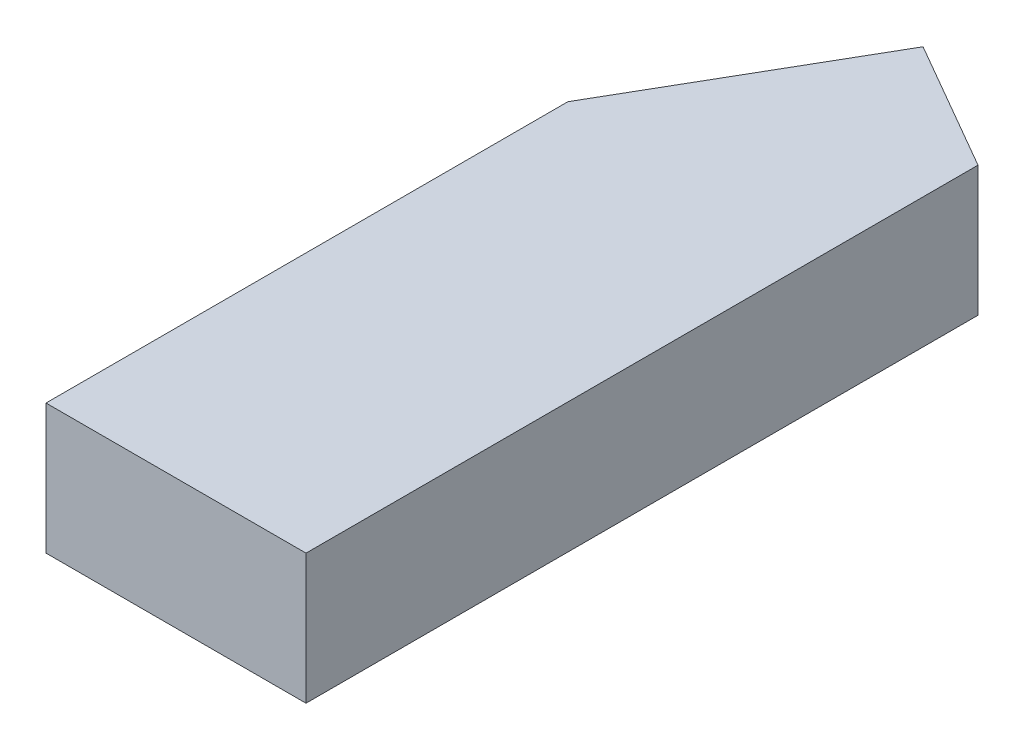
ISO-10303-21;
HEADER;
FILE_DESCRIPTION(('STEP AP214'),'2;1');
FILE_NAME('part.step','',(''),(''),'','','');
FILE_SCHEMA(('AUTOMOTIVE_DESIGN { 1 0 10303 214 1 1 1 1 }'));
ENDSEC;
DATA;
#1=APPLICATION_CONTEXT('core data for automotive mechanical design processes');
#2=APPLICATION_PROTOCOL_DEFINITION('international standard','automotive_design',2000,#1);
#3=PRODUCT_CONTEXT('',#1,'mechanical');
#4=PRODUCT('Part','Part','',(#3));
#5=PRODUCT_RELATED_PRODUCT_CATEGORY('part','',(#4));
#6=PRODUCT_DEFINITION_FORMATION('','',#4);
#7=PRODUCT_DEFINITION_CONTEXT('part definition',#1,'design');
#8=PRODUCT_DEFINITION('design','',#6,#7);
#9=PRODUCT_DEFINITION_SHAPE('','',#8);
#10=(LENGTH_UNIT() NAMED_UNIT(*) SI_UNIT(.MILLI.,.METRE.));
#11=(NAMED_UNIT(*) PLANE_ANGLE_UNIT() SI_UNIT($,.RADIAN.));
#12=(NAMED_UNIT(*) SI_UNIT($,.STERADIAN.) SOLID_ANGLE_UNIT());
#13=UNCERTAINTY_MEASURE_WITH_UNIT(LENGTH_MEASURE(1.E-05),#10,'distance_accuracy_value','');
#14=(GEOMETRIC_REPRESENTATION_CONTEXT(3) GLOBAL_UNCERTAINTY_ASSIGNED_CONTEXT((#13)) GLOBAL_UNIT_ASSIGNED_CONTEXT((#10,
#11,#12)) REPRESENTATION_CONTEXT('',''));
#15=CARTESIAN_POINT('',(0.,0.,0.));
#16=DIRECTION('',(0.,0.,1.));
#17=DIRECTION('',(1.,0.,0.));
#18=AXIS2_PLACEMENT_3D('',#15,#16,#17);
#19=CARTESIAN_POINT('',(59.9615242270666,10.,17.0717967697246));
#20=DIRECTION('',(-1.,0.,0.));
#21=DIRECTION('',(0.,0.,1.));
#22=AXIS2_PLACEMENT_3D('',#19,#20,#21);
#23=PLANE('',#22);
#24=DIRECTION('',(0.,0.,-1.));
#25=VECTOR('',#24,1.);
#26=CARTESIAN_POINT('',(59.9615242270666,0.,17.0717967697246));
#27=LINE('',#26,#25);
#28=CARTESIAN_POINT('',(59.9615242270666,0.,17.0717967697246));
#29=VERTEX_POINT('',#28);
#30=CARTESIAN_POINT('',(59.9615242270658,0.,-34.6188021535207));
#31=VERTEX_POINT('',#30);
#32=EDGE_CURVE('E154',#29,#31,#27,.T.);
#33=ORIENTED_EDGE('',*,*,#32,.T.);
#34=DIRECTION('',(0.,-1.,0.));
#35=VECTOR('',#34,1.);
#36=CARTESIAN_POINT('',(59.9615242270658,10.,-34.6188021535207));
#37=LINE('',#36,#35);
#38=CARTESIAN_POINT('',(59.9615242270658,10.,-34.6188021535207));
#39=VERTEX_POINT('',#38);
#40=EDGE_CURVE('E12',#39,#31,#37,.T.);
#41=ORIENTED_EDGE('',*,*,#40,.F.);
#42=DIRECTION('',(0.,0.,-1.));
#43=VECTOR('',#42,1.);
#44=CARTESIAN_POINT('',(59.9615242270666,10.,17.0717967697246));
#45=LINE('',#44,#43);
#46=CARTESIAN_POINT('',(59.9615242270666,10.,17.0717967697246));
#47=VERTEX_POINT('',#46);
#48=EDGE_CURVE('E133',#47,#39,#45,.T.);
#49=ORIENTED_EDGE('',*,*,#48,.F.);
#50=DIRECTION('',(0.,-1.,0.));
#51=VECTOR('',#50,1.);
#52=CARTESIAN_POINT('',(59.9615242270666,10.,17.0717967697246));
#53=LINE('',#52,#51);
#54=EDGE_CURVE('E121',#47,#29,#53,.T.);
#55=ORIENTED_EDGE('',*,*,#54,.T.);
#56=EDGE_LOOP('',(#33,#41,#49,#55));
#57=FACE_BOUND('',#56,.T.);
#58=ADVANCED_FACE('F46',(#57),#23,.F.);
#59=CARTESIAN_POINT('',(59.9615242270658,10.,-34.6188021535207));
#60=DIRECTION('',(-0.499999999999999,0.,0.866025403784439));
#61=DIRECTION('',(0.866025403784439,0.,0.499999999999999));
#62=AXIS2_PLACEMENT_3D('',#59,#60,#61);
#63=PLANE('',#62);
#64=DIRECTION('',(-0.866025403784439,0.,-0.499999999999999));
#65=VECTOR('',#64,1.);
#66=CARTESIAN_POINT('',(59.9615242270658,0.,-34.6188021535207));
#67=LINE('',#66,#65);
#68=CARTESIAN_POINT('',(49.9615242270658,0.,-40.392304845417));
#69=VERTEX_POINT('',#68);
#70=EDGE_CURVE('E151',#31,#69,#67,.T.);
#71=ORIENTED_EDGE('',*,*,#70,.T.);
#72=DIRECTION('',(0.,-1.,0.));
#73=VECTOR('',#72,1.);
#74=CARTESIAN_POINT('',(49.9615242270658,10.,-40.392304845417));
#75=LINE('',#74,#73);
#76=CARTESIAN_POINT('',(49.9615242270658,10.,-40.392304845417));
#77=VERTEX_POINT('',#76);
#78=EDGE_CURVE('E55',#77,#69,#75,.T.);
#79=ORIENTED_EDGE('',*,*,#78,.F.);
#80=DIRECTION('',(-0.866025403784439,0.,-0.499999999999999));
#81=VECTOR('',#80,1.);
#82=CARTESIAN_POINT('',(59.9615242270658,10.,-34.6188021535207));
#83=LINE('',#82,#81);
#84=EDGE_CURVE('E97',#39,#77,#83,.T.);
#85=ORIENTED_EDGE('',*,*,#84,.F.);
#86=ORIENTED_EDGE('',*,*,#40,.T.);
#87=EDGE_LOOP('',(#71,#79,#85,#86));
#88=FACE_BOUND('',#87,.T.);
#89=ADVANCED_FACE('F170',(#88),#63,.F.);
#90=CARTESIAN_POINT('',(39.9615242270658,10.,-23.0717967697282));
#91=DIRECTION('',(0.866025403784439,0.,0.499999999999999));
#92=DIRECTION('',(0.499999999999999,0.,-0.866025403784439));
#93=AXIS2_PLACEMENT_3D('',#90,#91,#92);
#94=PLANE('',#93);
#95=DIRECTION('',(-0.499999999999999,0.,0.866025403784439));
#96=VECTOR('',#95,1.);
#97=CARTESIAN_POINT('',(39.9615242270658,0.,-23.0717967697282));
#98=LINE('',#97,#96);
#99=CARTESIAN_POINT('',(39.9615242270658,0.,-23.0717967697282));
#100=VERTEX_POINT('',#99);
#101=EDGE_CURVE('E113',#69,#100,#98,.T.);
#102=ORIENTED_EDGE('',*,*,#101,.T.);
#103=DIRECTION('',(0.,-1.,0.));
#104=VECTOR('',#103,1.);
#105=CARTESIAN_POINT('',(39.9615242270658,10.,-23.0717967697282));
#106=LINE('',#105,#104);
#107=CARTESIAN_POINT('',(39.9615242270658,10.,-23.0717967697282));
#108=VERTEX_POINT('',#107);
#109=EDGE_CURVE('E110',#108,#100,#106,.T.);
#110=ORIENTED_EDGE('',*,*,#109,.F.);
#111=DIRECTION('',(-0.499999999999999,0.,0.866025403784439));
#112=VECTOR('',#111,1.);
#113=CARTESIAN_POINT('',(39.9615242270658,10.,-23.0717967697282));
#114=LINE('',#113,#112);
#115=EDGE_CURVE('E101',#77,#108,#114,.T.);
#116=ORIENTED_EDGE('',*,*,#115,.F.);
#117=ORIENTED_EDGE('',*,*,#78,.T.);
#118=EDGE_LOOP('',(#102,#110,#116,#117));
#119=FACE_BOUND('',#118,.T.);
#120=ADVANCED_FACE('F111',(#119),#94,.F.);
#121=CARTESIAN_POINT('',(39.9615242270666,10.,17.0717967697246));
#122=DIRECTION('',(1.,0.,0.));
#123=DIRECTION('',(0.,0.,-1.));
#124=AXIS2_PLACEMENT_3D('',#121,#122,#123);
#125=PLANE('',#124);
#126=DIRECTION('',(0.,0.,1.));
#127=VECTOR('',#126,1.);
#128=CARTESIAN_POINT('',(39.9615242270666,0.,17.0717967697246));
#129=LINE('',#128,#127);
#130=CARTESIAN_POINT('',(39.9615242270666,0.,17.0717967697246));
#131=VERTEX_POINT('',#130);
#132=EDGE_CURVE('E83',#100,#131,#129,.T.);
#133=ORIENTED_EDGE('',*,*,#132,.T.);
#134=DIRECTION('',(0.,-1.,0.));
#135=VECTOR('',#134,1.);
#136=CARTESIAN_POINT('',(39.9615242270666,10.,17.0717967697246));
#137=LINE('',#136,#135);
#138=CARTESIAN_POINT('',(39.9615242270666,10.,17.0717967697246));
#139=VERTEX_POINT('',#138);
#140=EDGE_CURVE('E115',#139,#131,#137,.T.);
#141=ORIENTED_EDGE('',*,*,#140,.F.);
#142=DIRECTION('',(0.,0.,1.));
#143=VECTOR('',#142,1.);
#144=CARTESIAN_POINT('',(39.9615242270666,10.,17.0717967697246));
#145=LINE('',#144,#143);
#146=EDGE_CURVE('E105',#108,#139,#145,.T.);
#147=ORIENTED_EDGE('',*,*,#146,.F.);
#148=ORIENTED_EDGE('',*,*,#109,.T.);
#149=EDGE_LOOP('',(#133,#141,#147,#148));
#150=FACE_BOUND('',#149,.T.);
#151=ADVANCED_FACE('F117',(#150),#125,.F.);
#152=CARTESIAN_POINT('',(59.9615242270666,10.,17.0717967697246));
#153=DIRECTION('',(0.,0.,-1.));
#154=DIRECTION('',(-1.,0.,0.));
#155=AXIS2_PLACEMENT_3D('',#152,#153,#154);
#156=PLANE('',#155);
#157=DIRECTION('',(1.,0.,0.));
#158=VECTOR('',#157,1.);
#159=CARTESIAN_POINT('',(59.9615242270666,0.,17.0717967697246));
#160=LINE('',#159,#158);
#161=EDGE_CURVE('E89',#131,#29,#160,.T.);
#162=ORIENTED_EDGE('',*,*,#161,.T.);
#163=ORIENTED_EDGE('',*,*,#54,.F.);
#164=DIRECTION('',(1.,0.,0.));
#165=VECTOR('',#164,1.);
#166=CARTESIAN_POINT('',(59.9615242270666,10.,17.0717967697246));
#167=LINE('',#166,#165);
#168=EDGE_CURVE('E63',#139,#47,#167,.T.);
#169=ORIENTED_EDGE('',*,*,#168,.F.);
#170=ORIENTED_EDGE('',*,*,#140,.T.);
#171=EDGE_LOOP('',(#162,#163,#169,#170));
#172=FACE_BOUND('',#171,.T.);
#173=ADVANCED_FACE('F159',(#172),#156,.F.);
#174=CARTESIAN_POINT('',(0.,10.,0.));
#175=DIRECTION('',(0.,1.,0.));
#176=DIRECTION('',(0.,0.,1.));
#177=AXIS2_PLACEMENT_3D('',#174,#175,#176);
#178=PLANE('',#177);
#179=ORIENTED_EDGE('',*,*,#48,.T.);
#180=ORIENTED_EDGE('',*,*,#84,.T.);
#181=ORIENTED_EDGE('',*,*,#115,.T.);
#182=ORIENTED_EDGE('',*,*,#146,.T.);
#183=ORIENTED_EDGE('',*,*,#168,.T.);
#184=EDGE_LOOP('',(#179,#180,#181,#182,#183));
#185=FACE_BOUND('',#184,.T.);
#186=ADVANCED_FACE('F103',(#185),#178,.T.);
#187=CARTESIAN_POINT('',(0.,0.,0.));
#188=DIRECTION('',(0.,1.,0.));
#189=DIRECTION('',(0.,0.,1.));
#190=AXIS2_PLACEMENT_3D('',#187,#188,#189);
#191=PLANE('',#190);
#192=ORIENTED_EDGE('',*,*,#32,.F.);
#193=ORIENTED_EDGE('',*,*,#161,.F.);
#194=ORIENTED_EDGE('',*,*,#132,.F.);
#195=ORIENTED_EDGE('',*,*,#101,.F.);
#196=ORIENTED_EDGE('',*,*,#70,.F.);
#197=EDGE_LOOP('',(#192,#193,#194,#195,#196));
#198=FACE_BOUND('',#197,.T.);
#199=ADVANCED_FACE('F150',(#198),#191,.F.);
#200=CLOSED_SHELL('',(#58,#89,#120,#151,#173,#186,#199));
#201=MANIFOLD_SOLID_BREP('B2',#200);
#202=ADVANCED_BREP_SHAPE_REPRESENTATION('',(#18,#201),#14);
#203=SHAPE_DEFINITION_REPRESENTATION(#9,#202);
ENDSEC;
END-ISO-10303-21;
